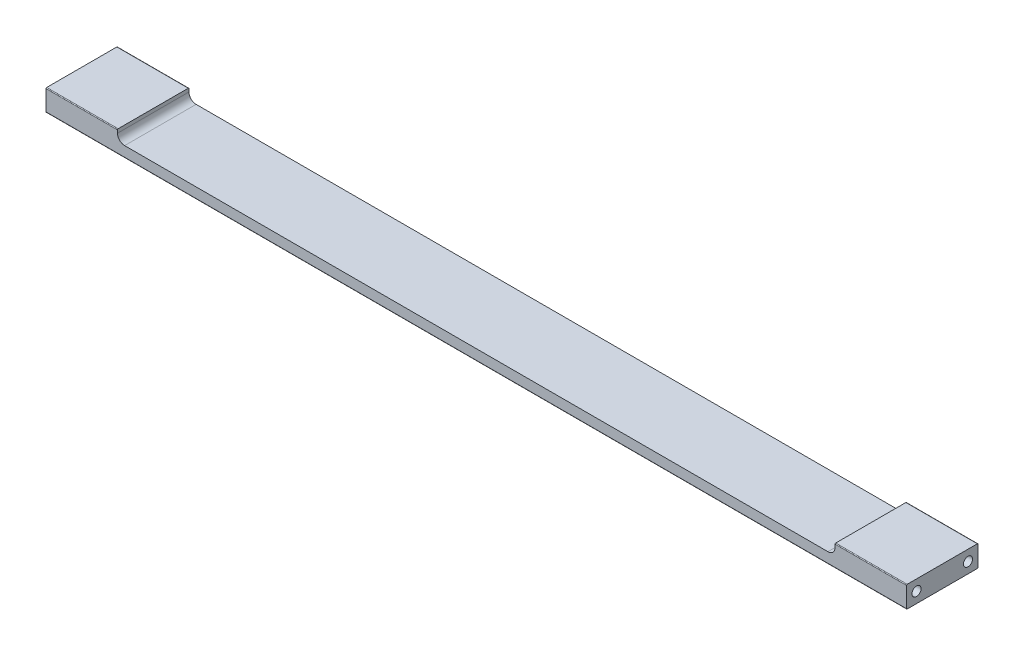
ISO-10303-21;
HEADER;
FILE_DESCRIPTION(('STEP AP214'),'2;1');
FILE_NAME('part.step','',(''),(''),'','','');
FILE_SCHEMA(('AUTOMOTIVE_DESIGN { 1 0 10303 214 1 1 1 1 }'));
ENDSEC;
DATA;
#1=APPLICATION_CONTEXT('core data for automotive mechanical design processes');
#2=APPLICATION_PROTOCOL_DEFINITION('international standard','automotive_design',2000,#1);
#3=PRODUCT_CONTEXT('',#1,'mechanical');
#4=PRODUCT('Part','Part','',(#3));
#5=PRODUCT_RELATED_PRODUCT_CATEGORY('part','',(#4));
#6=PRODUCT_DEFINITION_FORMATION('','',#4);
#7=PRODUCT_DEFINITION_CONTEXT('part definition',#1,'design');
#8=PRODUCT_DEFINITION('design','',#6,#7);
#9=PRODUCT_DEFINITION_SHAPE('','',#8);
#10=(LENGTH_UNIT() NAMED_UNIT(*) SI_UNIT(.MILLI.,.METRE.));
#11=(NAMED_UNIT(*) PLANE_ANGLE_UNIT() SI_UNIT($,.RADIAN.));
#12=(NAMED_UNIT(*) SI_UNIT($,.STERADIAN.) SOLID_ANGLE_UNIT());
#13=UNCERTAINTY_MEASURE_WITH_UNIT(LENGTH_MEASURE(1.E-05),#10,'distance_accuracy_value','');
#14=(GEOMETRIC_REPRESENTATION_CONTEXT(3) GLOBAL_UNCERTAINTY_ASSIGNED_CONTEXT((#13)) GLOBAL_UNIT_ASSIGNED_CONTEXT((#10,
#11,#12)) REPRESENTATION_CONTEXT('',''));
#15=CARTESIAN_POINT('',(0.,0.,0.));
#16=DIRECTION('',(0.,0.,1.));
#17=DIRECTION('',(1.,0.,0.));
#18=AXIS2_PLACEMENT_3D('',#15,#16,#17);
#19=CARTESIAN_POINT('',(0.,4.7625,0.));
#20=DIRECTION('',(0.,1.,0.));
#21=DIRECTION('',(0.,0.,1.));
#22=AXIS2_PLACEMENT_3D('',#19,#20,#21);
#23=PLANE('',#22);
#24=DIRECTION('',(0.,0.,-1.));
#25=VECTOR('',#24,1.);
#26=CARTESIAN_POINT('',(-159.385,4.76249999999999,15.875));
#27=LINE('',#26,#25);
#28=CARTESIAN_POINT('',(-159.385,4.76249999999999,15.560675));
#29=VERTEX_POINT('',#28);
#30=CARTESIAN_POINT('',(-159.385,4.76249999999999,-15.560675));
#31=VERTEX_POINT('',#30);
#32=EDGE_CURVE('E205',#29,#31,#27,.T.);
#33=ORIENTED_EDGE('',*,*,#32,.T.);
#34=DIRECTION('',(-1.,0.,0.));
#35=VECTOR('',#34,1.);
#36=CARTESIAN_POINT('',(0.,4.7625,-15.560675));
#37=LINE('',#36,#35);
#38=CARTESIAN_POINT('',(-191.135,4.7625,-15.560675));
#39=VERTEX_POINT('',#38);
#40=EDGE_CURVE('E299',#31,#39,#37,.T.);
#41=ORIENTED_EDGE('',*,*,#40,.T.);
#42=DIRECTION('',(0.,0.,1.));
#43=VECTOR('',#42,1.);
#44=CARTESIAN_POINT('',(-191.135,4.7625,-15.875));
#45=LINE('',#44,#43);
#46=CARTESIAN_POINT('',(-191.135,4.7625,15.560675));
#47=VERTEX_POINT('',#46);
#48=EDGE_CURVE('E242',#39,#47,#45,.T.);
#49=ORIENTED_EDGE('',*,*,#48,.T.);
#50=DIRECTION('',(1.,0.,0.));
#51=VECTOR('',#50,1.);
#52=CARTESIAN_POINT('',(0.,4.7625,15.560675));
#53=LINE('',#52,#51);
#54=EDGE_CURVE('E296',#47,#29,#53,.T.);
#55=ORIENTED_EDGE('',*,*,#54,.T.);
#56=EDGE_LOOP('',(#33,#41,#49,#55));
#57=FACE_BOUND('',#56,.T.);
#58=ADVANCED_FACE('F37',(#57),#23,.T.);
#59=CARTESIAN_POINT('',(0.,4.448175,-15.560675));
#60=DIRECTION('',(-1.,0.,0.));
#61=DIRECTION('',(0.,0.,1.));
#62=AXIS2_PLACEMENT_3D('',#59,#60,#61);
#63=CYLINDRICAL_SURFACE('',#62,0.314325);
#64=CARTESIAN_POINT('',(-159.385,4.448175,-15.560675));
#65=DIRECTION('',(-1.,0.,0.));
#66=DIRECTION('',(0.,0.,1.));
#67=AXIS2_PLACEMENT_3D('',#64,#65,#66);
#68=CIRCLE('',#67,0.314325);
#69=CARTESIAN_POINT('',(-159.385,4.448175,-15.875));
#70=VERTEX_POINT('',#69);
#71=EDGE_CURVE('E216',#70,#31,#68,.F.);
#72=ORIENTED_EDGE('',*,*,#71,.F.);
#73=DIRECTION('',(-1.,0.,0.));
#74=VECTOR('',#73,1.);
#75=CARTESIAN_POINT('',(-191.135,4.448175,-15.875));
#76=LINE('',#75,#74);
#77=CARTESIAN_POINT('',(-191.135,4.448175,-15.875));
#78=VERTEX_POINT('',#77);
#79=EDGE_CURVE('E289',#78,#70,#76,.F.);
#80=ORIENTED_EDGE('',*,*,#79,.F.);
#81=CARTESIAN_POINT('',(-191.135,4.448175,-15.560675));
#82=DIRECTION('',(-1.,0.,0.));
#83=DIRECTION('',(0.,0.,1.));
#84=AXIS2_PLACEMENT_3D('',#81,#82,#83);
#85=CIRCLE('',#84,0.314325);
#86=EDGE_CURVE('E60',#39,#78,#85,.T.);
#87=ORIENTED_EDGE('',*,*,#86,.F.);
#88=ORIENTED_EDGE('',*,*,#40,.F.);
#89=EDGE_LOOP('',(#72,#80,#87,#88));
#90=FACE_BOUND('',#89,.T.);
#91=ADVANCED_FACE('F359',(#90),#63,.T.);
#92=CARTESIAN_POINT('',(0.,4.448175,15.560675));
#93=DIRECTION('',(1.,0.,0.));
#94=DIRECTION('',(0.,0.,-1.));
#95=AXIS2_PLACEMENT_3D('',#92,#93,#94);
#96=CYLINDRICAL_SURFACE('',#95,0.314325);
#97=CARTESIAN_POINT('',(-159.385,4.448175,15.560675));
#98=DIRECTION('',(-1.,0.,0.));
#99=DIRECTION('',(0.,0.,1.));
#100=AXIS2_PLACEMENT_3D('',#97,#98,#99);
#101=CIRCLE('',#100,0.314325);
#102=CARTESIAN_POINT('',(-159.385,4.448175,15.875));
#103=VERTEX_POINT('',#102);
#104=EDGE_CURVE('E11',#29,#103,#101,.F.);
#105=ORIENTED_EDGE('',*,*,#104,.F.);
#106=ORIENTED_EDGE('',*,*,#54,.F.);
#107=CARTESIAN_POINT('',(-191.135,4.448175,15.560675));
#108=DIRECTION('',(-1.,0.,0.));
#109=DIRECTION('',(0.,0.,1.));
#110=AXIS2_PLACEMENT_3D('',#107,#108,#109);
#111=CIRCLE('',#110,0.314325);
#112=CARTESIAN_POINT('',(-191.135,4.448175,15.875));
#113=VERTEX_POINT('',#112);
#114=EDGE_CURVE('E281',#113,#47,#111,.T.);
#115=ORIENTED_EDGE('',*,*,#114,.F.);
#116=DIRECTION('',(1.,0.,0.));
#117=VECTOR('',#116,1.);
#118=CARTESIAN_POINT('',(-191.135,4.448175,15.875));
#119=LINE('',#118,#117);
#120=EDGE_CURVE('E257',#103,#113,#119,.F.);
#121=ORIENTED_EDGE('',*,*,#120,.F.);
#122=EDGE_LOOP('',(#105,#106,#115,#121));
#123=FACE_BOUND('',#122,.T.);
#124=ADVANCED_FACE('F336',(#123),#96,.T.);
#125=CARTESIAN_POINT('',(-191.135,-4.7625,-15.875));
#126=DIRECTION('',(-1.,0.,0.));
#127=DIRECTION('',(0.,0.,1.));
#128=AXIS2_PLACEMENT_3D('',#125,#126,#127);
#129=PLANE('',#128);
#130=CARTESIAN_POINT('',(-191.135,0.,-11.43));
#131=DIRECTION('',(-1.,0.,0.));
#132=DIRECTION('',(0.,0.,1.));
#133=AXIS2_PLACEMENT_3D('',#130,#131,#132);
#134=CIRCLE('',#133,2.01929999999999);
#135=CARTESIAN_POINT('',(-191.135,0.,-9.41070000000001));
#136=VERTEX_POINT('',#135);
#137=EDGE_CURVE('E230',#136,#136,#134,.T.);
#138=ORIENTED_EDGE('',*,*,#137,.F.);
#139=EDGE_LOOP('',(#138));
#140=FACE_BOUND('',#139,.T.);
#141=CARTESIAN_POINT('',(-191.135,0.,11.43));
#142=DIRECTION('',(-1.,0.,0.));
#143=DIRECTION('',(0.,0.,1.));
#144=AXIS2_PLACEMENT_3D('',#141,#142,#143);
#145=CIRCLE('',#144,2.01929999999999);
#146=CARTESIAN_POINT('',(-191.135,0.,13.4493));
#147=VERTEX_POINT('',#146);
#148=EDGE_CURVE('E236',#147,#147,#145,.T.);
#149=ORIENTED_EDGE('',*,*,#148,.F.);
#150=EDGE_LOOP('',(#149));
#151=FACE_BOUND('',#150,.T.);
#152=DIRECTION('',(0.,0.,1.));
#153=VECTOR('',#152,1.);
#154=CARTESIAN_POINT('',(-191.135,-4.7625,-15.875));
#155=LINE('',#154,#153);
#156=CARTESIAN_POINT('',(-191.135,-4.7625,-15.560675));
#157=VERTEX_POINT('',#156);
#158=CARTESIAN_POINT('',(-191.135,-4.7625,15.560675));
#159=VERTEX_POINT('',#158);
#160=EDGE_CURVE('E248',#157,#159,#155,.T.);
#161=ORIENTED_EDGE('',*,*,#160,.T.);
#162=CARTESIAN_POINT('',(-191.135,-4.448175,15.560675));
#163=DIRECTION('',(-1.,0.,0.));
#164=DIRECTION('',(0.,0.,1.));
#165=AXIS2_PLACEMENT_3D('',#162,#163,#164);
#166=CIRCLE('',#165,0.314325);
#167=CARTESIAN_POINT('',(-191.135,-4.448175,15.875));
#168=VERTEX_POINT('',#167);
#169=EDGE_CURVE('E286',#159,#168,#166,.T.);
#170=ORIENTED_EDGE('',*,*,#169,.T.);
#171=DIRECTION('',(0.,1.,0.));
#172=VECTOR('',#171,1.);
#173=CARTESIAN_POINT('',(-191.135,-4.7625,15.875));
#174=LINE('',#173,#172);
#175=EDGE_CURVE('E254',#168,#113,#174,.T.);
#176=ORIENTED_EDGE('',*,*,#175,.T.);
#177=ORIENTED_EDGE('',*,*,#114,.T.);
#178=ORIENTED_EDGE('',*,*,#48,.F.);
#179=ORIENTED_EDGE('',*,*,#86,.T.);
#180=DIRECTION('',(0.,1.,0.));
#181=VECTOR('',#180,1.);
#182=CARTESIAN_POINT('',(-191.135,-4.7625,-15.875));
#183=LINE('',#182,#181);
#184=CARTESIAN_POINT('',(-191.135,-4.448175,-15.875));
#185=VERTEX_POINT('',#184);
#186=EDGE_CURVE('E255',#185,#78,#183,.T.);
#187=ORIENTED_EDGE('',*,*,#186,.F.);
#188=CARTESIAN_POINT('',(-191.135,-4.448175,-15.560675));
#189=DIRECTION('',(-1.,0.,0.));
#190=DIRECTION('',(0.,0.,1.));
#191=AXIS2_PLACEMENT_3D('',#188,#189,#190);
#192=CIRCLE('',#191,0.314325);
#193=EDGE_CURVE('E284',#185,#157,#192,.T.);
#194=ORIENTED_EDGE('',*,*,#193,.T.);
#195=EDGE_LOOP('',(#161,#170,#176,#177,#178,#179,#187,#194));
#196=FACE_BOUND('',#195,.T.);
#197=ADVANCED_FACE('F340',(#140,#151,#196),#129,.T.);
#198=CARTESIAN_POINT('',(-191.135,-4.7625,-15.875));
#199=DIRECTION('',(0.,0.,-1.));
#200=DIRECTION('',(-1.,0.,0.));
#201=AXIS2_PLACEMENT_3D('',#198,#199,#200);
#202=PLANE('',#201);
#203=DIRECTION('',(0.,1.,0.));
#204=VECTOR('',#203,1.);
#205=CARTESIAN_POINT('',(-159.385,4.76249999999999,-15.875));
#206=LINE('',#205,#204);
#207=CARTESIAN_POINT('',(-159.385,3.17500000000004,-15.875));
#208=VERTEX_POINT('',#207);
#209=EDGE_CURVE('E186',#208,#70,#206,.T.);
#210=ORIENTED_EDGE('',*,*,#209,.F.);
#211=CARTESIAN_POINT('',(-156.21,3.175,-15.875));
#212=DIRECTION('',(0.,0.,-1.));
#213=DIRECTION('',(1.,0.,0.));
#214=AXIS2_PLACEMENT_3D('',#211,#212,#213);
#215=CIRCLE('',#214,3.17499999999999);
#216=CARTESIAN_POINT('',(-156.21,0.,-15.875));
#217=VERTEX_POINT('',#216);
#218=EDGE_CURVE('E188',#217,#208,#215,.T.);
#219=ORIENTED_EDGE('',*,*,#218,.F.);
#220=DIRECTION('',(-1.,0.,0.));
#221=VECTOR('',#220,1.);
#222=CARTESIAN_POINT('',(-156.21,0.,-15.875));
#223=LINE('',#222,#221);
#224=CARTESIAN_POINT('',(156.21,0.,-15.875));
#225=VERTEX_POINT('',#224);
#226=EDGE_CURVE('E200',#225,#217,#223,.T.);
#227=ORIENTED_EDGE('',*,*,#226,.F.);
#228=CARTESIAN_POINT('',(156.21,3.17499999999996,-15.875));
#229=DIRECTION('',(0.,0.,-1.));
#230=DIRECTION('',(1.,0.,0.));
#231=AXIS2_PLACEMENT_3D('',#228,#229,#230);
#232=CIRCLE('',#231,3.17500000000001);
#233=CARTESIAN_POINT('',(159.385,3.17499999999996,-15.875));
#234=VERTEX_POINT('',#233);
#235=EDGE_CURVE('E198',#234,#225,#232,.T.);
#236=ORIENTED_EDGE('',*,*,#235,.F.);
#237=DIRECTION('',(0.,-1.,0.));
#238=VECTOR('',#237,1.);
#239=CARTESIAN_POINT('',(159.385,3.17499999999998,-15.875));
#240=LINE('',#239,#238);
#241=CARTESIAN_POINT('',(159.385,4.448175,-15.875));
#242=VERTEX_POINT('',#241);
#243=EDGE_CURVE('E165',#242,#234,#240,.T.);
#244=ORIENTED_EDGE('',*,*,#243,.F.);
#245=CARTESIAN_POINT('',(191.135,4.448175,-15.875));
#246=VERTEX_POINT('',#245);
#247=EDGE_CURVE('E288',#242,#246,#76,.F.);
#248=ORIENTED_EDGE('',*,*,#247,.T.);
#249=DIRECTION('',(0.,1.,0.));
#250=VECTOR('',#249,1.);
#251=CARTESIAN_POINT('',(191.135,-4.7625,-15.875));
#252=LINE('',#251,#250);
#253=CARTESIAN_POINT('',(191.135,-4.448175,-15.875));
#254=VERTEX_POINT('',#253);
#255=EDGE_CURVE('E258',#254,#246,#252,.T.);
#256=ORIENTED_EDGE('',*,*,#255,.F.);
#257=DIRECTION('',(-1.,0.,0.));
#258=VECTOR('',#257,1.);
#259=CARTESIAN_POINT('',(-191.135,-4.448175,-15.875));
#260=LINE('',#259,#258);
#261=EDGE_CURVE('E292',#254,#185,#260,.T.);
#262=ORIENTED_EDGE('',*,*,#261,.T.);
#263=ORIENTED_EDGE('',*,*,#186,.T.);
#264=ORIENTED_EDGE('',*,*,#79,.T.);
#265=EDGE_LOOP('',(#210,#219,#227,#236,#244,#248,#256,#262,#263,#264));
#266=FACE_BOUND('',#265,.T.);
#267=ADVANCED_FACE('F320',(#266),#202,.T.);
#268=CARTESIAN_POINT('',(191.135,-4.7625,-15.875));
#269=DIRECTION('',(1.,0.,0.));
#270=DIRECTION('',(0.,0.,-1.));
#271=AXIS2_PLACEMENT_3D('',#268,#269,#270);
#272=PLANE('',#271);
#273=CARTESIAN_POINT('',(191.135,0.,11.43));
#274=DIRECTION('',(1.,0.,0.));
#275=DIRECTION('',(0.,0.,-1.));
#276=AXIS2_PLACEMENT_3D('',#273,#274,#275);
#277=CIRCLE('',#276,2.01929999999999);
#278=CARTESIAN_POINT('',(191.135,0.,9.41070000000001));
#279=VERTEX_POINT('',#278);
#280=EDGE_CURVE('E218',#279,#279,#277,.T.);
#281=ORIENTED_EDGE('',*,*,#280,.F.);
#282=EDGE_LOOP('',(#281));
#283=FACE_BOUND('',#282,.T.);
#284=CARTESIAN_POINT('',(191.135,0.,-11.43));
#285=DIRECTION('',(1.,0.,0.));
#286=DIRECTION('',(0.,0.,-1.));
#287=AXIS2_PLACEMENT_3D('',#284,#285,#286);
#288=CIRCLE('',#287,2.01929999999999);
#289=CARTESIAN_POINT('',(191.135,0.,-13.4493));
#290=VERTEX_POINT('',#289);
#291=EDGE_CURVE('E224',#290,#290,#288,.T.);
#292=ORIENTED_EDGE('',*,*,#291,.F.);
#293=EDGE_LOOP('',(#292));
#294=FACE_BOUND('',#293,.T.);
#295=DIRECTION('',(0.,1.,0.));
#296=VECTOR('',#295,1.);
#297=CARTESIAN_POINT('',(191.135,-4.7625,15.875));
#298=LINE('',#297,#296);
#299=CARTESIAN_POINT('',(191.135,-4.448175,15.875));
#300=VERTEX_POINT('',#299);
#301=CARTESIAN_POINT('',(191.135,4.448175,15.875));
#302=VERTEX_POINT('',#301);
#303=EDGE_CURVE('E261',#300,#302,#298,.T.);
#304=ORIENTED_EDGE('',*,*,#303,.F.);
#305=CARTESIAN_POINT('',(191.135,-4.448175,15.560675));
#306=DIRECTION('',(1.,0.,0.));
#307=DIRECTION('',(0.,0.,-1.));
#308=AXIS2_PLACEMENT_3D('',#305,#306,#307);
#309=CIRCLE('',#308,0.314325);
#310=CARTESIAN_POINT('',(191.135,-4.7625,15.560675));
#311=VERTEX_POINT('',#310);
#312=EDGE_CURVE('E275',#300,#311,#309,.T.);
#313=ORIENTED_EDGE('',*,*,#312,.T.);
#314=DIRECTION('',(0.,0.,-1.));
#315=VECTOR('',#314,1.);
#316=CARTESIAN_POINT('',(191.135,-4.7625,-15.875));
#317=LINE('',#316,#315);
#318=CARTESIAN_POINT('',(191.135,-4.7625,-15.560675));
#319=VERTEX_POINT('',#318);
#320=EDGE_CURVE('E251',#311,#319,#317,.T.);
#321=ORIENTED_EDGE('',*,*,#320,.T.);
#322=CARTESIAN_POINT('',(191.135,-4.448175,-15.560675));
#323=DIRECTION('',(1.,0.,0.));
#324=DIRECTION('',(0.,0.,-1.));
#325=AXIS2_PLACEMENT_3D('',#322,#323,#324);
#326=CIRCLE('',#325,0.314325);
#327=EDGE_CURVE('E273',#319,#254,#326,.T.);
#328=ORIENTED_EDGE('',*,*,#327,.T.);
#329=ORIENTED_EDGE('',*,*,#255,.T.);
#330=CARTESIAN_POINT('',(191.135,4.448175,-15.560675));
#331=DIRECTION('',(1.,0.,0.));
#332=DIRECTION('',(0.,0.,-1.));
#333=AXIS2_PLACEMENT_3D('',#330,#331,#332);
#334=CIRCLE('',#333,0.314325);
#335=CARTESIAN_POINT('',(191.135,4.7625,-15.560675));
#336=VERTEX_POINT('',#335);
#337=EDGE_CURVE('E271',#246,#336,#334,.T.);
#338=ORIENTED_EDGE('',*,*,#337,.T.);
#339=DIRECTION('',(0.,0.,-1.));
#340=VECTOR('',#339,1.);
#341=CARTESIAN_POINT('',(191.135,4.7625,-15.875));
#342=LINE('',#341,#340);
#343=CARTESIAN_POINT('',(191.135,4.7625,15.560675));
#344=VERTEX_POINT('',#343);
#345=EDGE_CURVE('E245',#344,#336,#342,.T.);
#346=ORIENTED_EDGE('',*,*,#345,.F.);
#347=CARTESIAN_POINT('',(191.135,4.448175,15.560675));
#348=DIRECTION('',(1.,0.,0.));
#349=DIRECTION('',(0.,0.,-1.));
#350=AXIS2_PLACEMENT_3D('',#347,#348,#349);
#351=CIRCLE('',#350,0.314325);
#352=EDGE_CURVE('E269',#344,#302,#351,.T.);
#353=ORIENTED_EDGE('',*,*,#352,.T.);
#354=EDGE_LOOP('',(#304,#313,#321,#328,#329,#338,#346,#353));
#355=FACE_BOUND('',#354,.T.);
#356=ADVANCED_FACE('F313',(#283,#294,#355),#272,.T.);
#357=CARTESIAN_POINT('',(-191.135,-4.7625,15.875));
#358=DIRECTION('',(0.,0.,1.));
#359=DIRECTION('',(1.,0.,0.));
#360=AXIS2_PLACEMENT_3D('',#357,#358,#359);
#361=PLANE('',#360);
#362=DIRECTION('',(0.,1.,0.));
#363=VECTOR('',#362,1.);
#364=CARTESIAN_POINT('',(-159.385,4.76249999999999,15.875));
#365=LINE('',#364,#363);
#366=CARTESIAN_POINT('',(-159.385,3.17500000000004,15.875));
#367=VERTEX_POINT('',#366);
#368=EDGE_CURVE('E195',#367,#103,#365,.T.);
#369=ORIENTED_EDGE('',*,*,#368,.T.);
#370=ORIENTED_EDGE('',*,*,#120,.T.);
#371=ORIENTED_EDGE('',*,*,#175,.F.);
#372=DIRECTION('',(1.,0.,0.));
#373=VECTOR('',#372,1.);
#374=CARTESIAN_POINT('',(191.135,-4.448175,15.875));
#375=LINE('',#374,#373);
#376=EDGE_CURVE('E266',#168,#300,#375,.T.);
#377=ORIENTED_EDGE('',*,*,#376,.T.);
#378=ORIENTED_EDGE('',*,*,#303,.T.);
#379=CARTESIAN_POINT('',(159.385,4.448175,15.875));
#380=VERTEX_POINT('',#379);
#381=EDGE_CURVE('E185',#302,#380,#119,.F.);
#382=ORIENTED_EDGE('',*,*,#381,.T.);
#383=DIRECTION('',(0.,-1.,0.));
#384=VECTOR('',#383,1.);
#385=CARTESIAN_POINT('',(159.385,3.17499999999998,15.875));
#386=LINE('',#385,#384);
#387=CARTESIAN_POINT('',(159.385,3.17499999999996,15.875));
#388=VERTEX_POINT('',#387);
#389=EDGE_CURVE('E52',#380,#388,#386,.T.);
#390=ORIENTED_EDGE('',*,*,#389,.T.);
#391=CARTESIAN_POINT('',(156.21,3.17499999999996,15.875));
#392=DIRECTION('',(0.,0.,-1.));
#393=DIRECTION('',(1.,0.,0.));
#394=AXIS2_PLACEMENT_3D('',#391,#392,#393);
#395=CIRCLE('',#394,3.17500000000001);
#396=CARTESIAN_POINT('',(156.21,0.,15.875));
#397=VERTEX_POINT('',#396);
#398=EDGE_CURVE('E173',#388,#397,#395,.T.);
#399=ORIENTED_EDGE('',*,*,#398,.T.);
#400=DIRECTION('',(-1.,0.,0.));
#401=VECTOR('',#400,1.);
#402=CARTESIAN_POINT('',(-156.21,0.,15.875));
#403=LINE('',#402,#401);
#404=CARTESIAN_POINT('',(-156.21,0.,15.875));
#405=VERTEX_POINT('',#404);
#406=EDGE_CURVE('E178',#397,#405,#403,.T.);
#407=ORIENTED_EDGE('',*,*,#406,.T.);
#408=CARTESIAN_POINT('',(-156.21,3.175,15.875));
#409=DIRECTION('',(0.,0.,-1.));
#410=DIRECTION('',(1.,0.,0.));
#411=AXIS2_PLACEMENT_3D('',#408,#409,#410);
#412=CIRCLE('',#411,3.17499999999999);
#413=EDGE_CURVE('E192',#405,#367,#412,.T.);
#414=ORIENTED_EDGE('',*,*,#413,.T.);
#415=EDGE_LOOP('',(#369,#370,#371,#377,#378,#382,#390,#399,#407,#414));
#416=FACE_BOUND('',#415,.T.);
#417=ADVANCED_FACE('F182',(#416),#361,.T.);
#418=CARTESIAN_POINT('',(0.,-4.7625,0.));
#419=DIRECTION('',(0.,1.,0.));
#420=DIRECTION('',(0.,0.,1.));
#421=AXIS2_PLACEMENT_3D('',#418,#419,#420);
#422=PLANE('',#421);
#423=ORIENTED_EDGE('',*,*,#320,.F.);
#424=DIRECTION('',(1.,0.,0.));
#425=VECTOR('',#424,1.);
#426=CARTESIAN_POINT('',(-191.135,-4.7625,15.560675));
#427=LINE('',#426,#425);
#428=EDGE_CURVE('E279',#311,#159,#427,.F.);
#429=ORIENTED_EDGE('',*,*,#428,.T.);
#430=ORIENTED_EDGE('',*,*,#160,.F.);
#431=DIRECTION('',(-1.,0.,0.));
#432=VECTOR('',#431,1.);
#433=CARTESIAN_POINT('',(191.135,-4.7625,-15.560675));
#434=LINE('',#433,#432);
#435=EDGE_CURVE('E277',#157,#319,#434,.F.);
#436=ORIENTED_EDGE('',*,*,#435,.T.);
#437=EDGE_LOOP('',(#423,#429,#430,#436));
#438=FACE_BOUND('',#437,.T.);
#439=ADVANCED_FACE('F350',(#438),#422,.F.);
#440=DIRECTION('',(0.,0.,-1.));
#441=VECTOR('',#440,1.);
#442=CARTESIAN_POINT('',(159.385,4.76249999999999,15.875));
#443=LINE('',#442,#441);
#444=CARTESIAN_POINT('',(159.385,4.76249999999999,15.560675));
#445=VERTEX_POINT('',#444);
#446=CARTESIAN_POINT('',(159.385,4.76249999999999,-15.560675));
#447=VERTEX_POINT('',#446);
#448=EDGE_CURVE('E170',#445,#447,#443,.T.);
#449=ORIENTED_EDGE('',*,*,#448,.F.);
#450=EDGE_CURVE('E295',#445,#344,#53,.T.);
#451=ORIENTED_EDGE('',*,*,#450,.T.);
#452=ORIENTED_EDGE('',*,*,#345,.T.);
#453=EDGE_CURVE('E300',#336,#447,#37,.T.);
#454=ORIENTED_EDGE('',*,*,#453,.T.);
#455=EDGE_LOOP('',(#449,#451,#452,#454));
#456=FACE_BOUND('',#455,.T.);
#457=ADVANCED_FACE('F307',(#456),#23,.T.);
#458=CARTESIAN_POINT('',(-191.135,-4.448175,15.560675));
#459=DIRECTION('',(-1.,0.,0.));
#460=DIRECTION('',(0.,0.,1.));
#461=AXIS2_PLACEMENT_3D('',#458,#459,#460);
#462=CYLINDRICAL_SURFACE('',#461,0.314325);
#463=ORIENTED_EDGE('',*,*,#169,.F.);
#464=ORIENTED_EDGE('',*,*,#428,.F.);
#465=ORIENTED_EDGE('',*,*,#312,.F.);
#466=ORIENTED_EDGE('',*,*,#376,.F.);
#467=EDGE_LOOP('',(#463,#464,#465,#466));
#468=FACE_BOUND('',#467,.T.);
#469=ADVANCED_FACE('F345',(#468),#462,.T.);
#470=CARTESIAN_POINT('',(-191.135,-4.448175,-15.560675));
#471=DIRECTION('',(1.,0.,0.));
#472=DIRECTION('',(0.,0.,-1.));
#473=AXIS2_PLACEMENT_3D('',#470,#471,#472);
#474=CYLINDRICAL_SURFACE('',#473,0.314325);
#475=ORIENTED_EDGE('',*,*,#327,.F.);
#476=ORIENTED_EDGE('',*,*,#435,.F.);
#477=ORIENTED_EDGE('',*,*,#193,.F.);
#478=ORIENTED_EDGE('',*,*,#261,.F.);
#479=EDGE_LOOP('',(#475,#476,#477,#478));
#480=FACE_BOUND('',#479,.T.);
#481=ADVANCED_FACE('F354',(#480),#474,.T.);
#482=CARTESIAN_POINT('',(159.385,4.448175,-15.560675));
#483=DIRECTION('',(1.,0.,0.));
#484=DIRECTION('',(0.,0.,-1.));
#485=AXIS2_PLACEMENT_3D('',#482,#483,#484);
#486=CIRCLE('',#485,0.314325);
#487=EDGE_CURVE('E208',#447,#242,#486,.F.);
#488=ORIENTED_EDGE('',*,*,#487,.F.);
#489=ORIENTED_EDGE('',*,*,#453,.F.);
#490=ORIENTED_EDGE('',*,*,#337,.F.);
#491=ORIENTED_EDGE('',*,*,#247,.F.);
#492=EDGE_LOOP('',(#488,#489,#490,#491));
#493=FACE_BOUND('',#492,.T.);
#494=ADVANCED_FACE('F316',(#493),#63,.T.);
#495=CARTESIAN_POINT('',(159.385,4.448175,15.560675));
#496=DIRECTION('',(1.,0.,0.));
#497=DIRECTION('',(0.,0.,-1.));
#498=AXIS2_PLACEMENT_3D('',#495,#496,#497);
#499=CIRCLE('',#498,0.314325);
#500=EDGE_CURVE('E45',#380,#445,#499,.F.);
#501=ORIENTED_EDGE('',*,*,#500,.F.);
#502=ORIENTED_EDGE('',*,*,#381,.F.);
#503=ORIENTED_EDGE('',*,*,#352,.F.);
#504=ORIENTED_EDGE('',*,*,#450,.F.);
#505=EDGE_LOOP('',(#501,#502,#503,#504));
#506=FACE_BOUND('',#505,.T.);
#507=ADVANCED_FACE('F39',(#506),#96,.T.);
#508=CARTESIAN_POINT('',(-165.735,0.,11.43));
#509=DIRECTION('',(-1.,0.,0.));
#510=DIRECTION('',(0.,0.,1.));
#511=AXIS2_PLACEMENT_3D('',#508,#509,#510);
#512=CONICAL_SURFACE('',#511,2.01929999999999,1.02974425867665);
#513=CARTESIAN_POINT('',(-164.521682151998,0.,11.43));
#514=VERTEX_POINT('',#513);
#515=VERTEX_LOOP('',#514);
#516=FACE_BOUND('',#515,.T.);
#517=CARTESIAN_POINT('',(-165.735,0.,11.43));
#518=DIRECTION('',(-1.,0.,0.));
#519=DIRECTION('',(0.,0.,1.));
#520=AXIS2_PLACEMENT_3D('',#517,#518,#519);
#521=CIRCLE('',#520,2.01929999999999);
#522=CARTESIAN_POINT('',(-165.735,0.,13.4493));
#523=VERTEX_POINT('',#522);
#524=EDGE_CURVE('E239',#523,#523,#521,.T.);
#525=ORIENTED_EDGE('',*,*,#524,.T.);
#526=EDGE_LOOP('',(#525));
#527=FACE_BOUND('',#526,.T.);
#528=ADVANCED_FACE('F372',(#516,#527),#512,.F.);
#529=CARTESIAN_POINT('',(-191.135,0.,11.43));
#530=DIRECTION('',(-1.,0.,0.));
#531=DIRECTION('',(0.,0.,1.));
#532=AXIS2_PLACEMENT_3D('',#529,#530,#531);
#533=CYLINDRICAL_SURFACE('',#532,2.01929999999999);
#534=ORIENTED_EDGE('',*,*,#524,.F.);
#535=EDGE_LOOP('',(#534));
#536=FACE_BOUND('',#535,.T.);
#537=ORIENTED_EDGE('',*,*,#148,.T.);
#538=EDGE_LOOP('',(#537));
#539=FACE_BOUND('',#538,.T.);
#540=ADVANCED_FACE('F393',(#536,#539),#533,.F.);
#541=CARTESIAN_POINT('',(-165.735,0.,-11.43));
#542=DIRECTION('',(-1.,0.,0.));
#543=DIRECTION('',(0.,0.,1.));
#544=AXIS2_PLACEMENT_3D('',#541,#542,#543);
#545=CONICAL_SURFACE('',#544,2.01929999999999,1.02974425867665);
#546=CARTESIAN_POINT('',(-164.521682151998,0.,-11.43));
#547=VERTEX_POINT('',#546);
#548=VERTEX_LOOP('',#547);
#549=FACE_BOUND('',#548,.T.);
#550=CARTESIAN_POINT('',(-165.735,0.,-11.43));
#551=DIRECTION('',(-1.,0.,0.));
#552=DIRECTION('',(0.,0.,1.));
#553=AXIS2_PLACEMENT_3D('',#550,#551,#552);
#554=CIRCLE('',#553,2.01929999999999);
#555=CARTESIAN_POINT('',(-165.735,0.,-9.41070000000001));
#556=VERTEX_POINT('',#555);
#557=EDGE_CURVE('E233',#556,#556,#554,.T.);
#558=ORIENTED_EDGE('',*,*,#557,.T.);
#559=EDGE_LOOP('',(#558));
#560=FACE_BOUND('',#559,.T.);
#561=ADVANCED_FACE('F397',(#549,#560),#545,.F.);
#562=CARTESIAN_POINT('',(-191.135,0.,-11.43));
#563=DIRECTION('',(-1.,0.,0.));
#564=DIRECTION('',(0.,0.,1.));
#565=AXIS2_PLACEMENT_3D('',#562,#563,#564);
#566=CYLINDRICAL_SURFACE('',#565,2.01929999999999);
#567=ORIENTED_EDGE('',*,*,#557,.F.);
#568=EDGE_LOOP('',(#567));
#569=FACE_BOUND('',#568,.T.);
#570=ORIENTED_EDGE('',*,*,#137,.T.);
#571=EDGE_LOOP('',(#570));
#572=FACE_BOUND('',#571,.T.);
#573=ADVANCED_FACE('F401',(#569,#572),#566,.F.);
#574=CARTESIAN_POINT('',(165.735,0.,-11.43));
#575=DIRECTION('',(1.,0.,0.));
#576=DIRECTION('',(0.,0.,-1.));
#577=AXIS2_PLACEMENT_3D('',#574,#575,#576);
#578=CONICAL_SURFACE('',#577,2.01929999999999,1.02974425867665);
#579=CARTESIAN_POINT('',(164.521682151998,0.,-11.43));
#580=VERTEX_POINT('',#579);
#581=VERTEX_LOOP('',#580);
#582=FACE_BOUND('',#581,.T.);
#583=CARTESIAN_POINT('',(165.735,0.,-11.43));
#584=DIRECTION('',(1.,0.,0.));
#585=DIRECTION('',(0.,0.,-1.));
#586=AXIS2_PLACEMENT_3D('',#583,#584,#585);
#587=CIRCLE('',#586,2.01929999999999);
#588=CARTESIAN_POINT('',(165.735,0.,-13.4493));
#589=VERTEX_POINT('',#588);
#590=EDGE_CURVE('E227',#589,#589,#587,.T.);
#591=ORIENTED_EDGE('',*,*,#590,.T.);
#592=EDGE_LOOP('',(#591));
#593=FACE_BOUND('',#592,.T.);
#594=ADVANCED_FACE('F405',(#582,#593),#578,.F.);
#595=CARTESIAN_POINT('',(191.135,0.,-11.43));
#596=DIRECTION('',(1.,0.,0.));
#597=DIRECTION('',(0.,0.,-1.));
#598=AXIS2_PLACEMENT_3D('',#595,#596,#597);
#599=CYLINDRICAL_SURFACE('',#598,2.01929999999999);
#600=ORIENTED_EDGE('',*,*,#590,.F.);
#601=EDGE_LOOP('',(#600));
#602=FACE_BOUND('',#601,.T.);
#603=ORIENTED_EDGE('',*,*,#291,.T.);
#604=EDGE_LOOP('',(#603));
#605=FACE_BOUND('',#604,.T.);
#606=ADVANCED_FACE('F409',(#602,#605),#599,.F.);
#607=CARTESIAN_POINT('',(165.735,0.,11.43));
#608=DIRECTION('',(1.,0.,0.));
#609=DIRECTION('',(0.,0.,-1.));
#610=AXIS2_PLACEMENT_3D('',#607,#608,#609);
#611=CONICAL_SURFACE('',#610,2.01929999999999,1.02974425867665);
#612=CARTESIAN_POINT('',(164.521682151998,0.,11.43));
#613=VERTEX_POINT('',#612);
#614=VERTEX_LOOP('',#613);
#615=FACE_BOUND('',#614,.T.);
#616=CARTESIAN_POINT('',(165.735,0.,11.43));
#617=DIRECTION('',(1.,0.,0.));
#618=DIRECTION('',(0.,0.,-1.));
#619=AXIS2_PLACEMENT_3D('',#616,#617,#618);
#620=CIRCLE('',#619,2.01929999999999);
#621=CARTESIAN_POINT('',(165.735,0.,9.41070000000001));
#622=VERTEX_POINT('',#621);
#623=EDGE_CURVE('E221',#622,#622,#620,.T.);
#624=ORIENTED_EDGE('',*,*,#623,.T.);
#625=EDGE_LOOP('',(#624));
#626=FACE_BOUND('',#625,.T.);
#627=ADVANCED_FACE('F413',(#615,#626),#611,.F.);
#628=CARTESIAN_POINT('',(191.135,0.,11.43));
#629=DIRECTION('',(1.,0.,0.));
#630=DIRECTION('',(0.,0.,-1.));
#631=AXIS2_PLACEMENT_3D('',#628,#629,#630);
#632=CYLINDRICAL_SURFACE('',#631,2.01929999999999);
#633=ORIENTED_EDGE('',*,*,#623,.F.);
#634=EDGE_LOOP('',(#633));
#635=FACE_BOUND('',#634,.T.);
#636=ORIENTED_EDGE('',*,*,#280,.T.);
#637=EDGE_LOOP('',(#636));
#638=FACE_BOUND('',#637,.T.);
#639=ADVANCED_FACE('F417',(#635,#638),#632,.F.);
#640=CARTESIAN_POINT('',(-159.385,4.76249999999999,15.875));
#641=DIRECTION('',(-1.,0.,0.));
#642=DIRECTION('',(0.,0.,1.));
#643=AXIS2_PLACEMENT_3D('',#640,#641,#642);
#644=PLANE('',#643);
#645=ORIENTED_EDGE('',*,*,#71,.T.);
#646=ORIENTED_EDGE('',*,*,#32,.F.);
#647=ORIENTED_EDGE('',*,*,#104,.T.);
#648=ORIENTED_EDGE('',*,*,#368,.F.);
#649=DIRECTION('',(0.,0.,-1.));
#650=VECTOR('',#649,1.);
#651=CARTESIAN_POINT('',(-159.385,3.17500000000004,15.875));
#652=LINE('',#651,#650);
#653=EDGE_CURVE('E209',#367,#208,#652,.T.);
#654=ORIENTED_EDGE('',*,*,#653,.T.);
#655=ORIENTED_EDGE('',*,*,#209,.T.);
#656=EDGE_LOOP('',(#645,#646,#647,#648,#654,#655));
#657=FACE_BOUND('',#656,.T.);
#658=ADVANCED_FACE('F332',(#657),#644,.F.);
#659=CARTESIAN_POINT('',(-156.21,3.175,15.875));
#660=DIRECTION('',(0.,0.,-1.));
#661=DIRECTION('',(-1.,0.,0.));
#662=AXIS2_PLACEMENT_3D('',#659,#660,#661);
#663=CYLINDRICAL_SURFACE('',#662,3.17499999999999);
#664=ORIENTED_EDGE('',*,*,#218,.T.);
#665=ORIENTED_EDGE('',*,*,#653,.F.);
#666=ORIENTED_EDGE('',*,*,#413,.F.);
#667=DIRECTION('',(0.,0.,-1.));
#668=VECTOR('',#667,1.);
#669=CARTESIAN_POINT('',(-156.21,0.,15.875));
#670=LINE('',#669,#668);
#671=EDGE_CURVE('E211',#405,#217,#670,.T.);
#672=ORIENTED_EDGE('',*,*,#671,.T.);
#673=EDGE_LOOP('',(#664,#665,#666,#672));
#674=FACE_BOUND('',#673,.T.);
#675=ADVANCED_FACE('F330',(#674),#663,.F.);
#676=CARTESIAN_POINT('',(-156.21,0.,15.875));
#677=DIRECTION('',(0.,-1.,0.));
#678=DIRECTION('',(1.,0.,0.));
#679=AXIS2_PLACEMENT_3D('',#676,#677,#678);
#680=PLANE('',#679);
#681=ORIENTED_EDGE('',*,*,#226,.T.);
#682=ORIENTED_EDGE('',*,*,#671,.F.);
#683=ORIENTED_EDGE('',*,*,#406,.F.);
#684=DIRECTION('',(0.,0.,-1.));
#685=VECTOR('',#684,1.);
#686=CARTESIAN_POINT('',(156.21,0.,15.875));
#687=LINE('',#686,#685);
#688=EDGE_CURVE('E169',#397,#225,#687,.T.);
#689=ORIENTED_EDGE('',*,*,#688,.T.);
#690=EDGE_LOOP('',(#681,#682,#683,#689));
#691=FACE_BOUND('',#690,.T.);
#692=ADVANCED_FACE('F325',(#691),#680,.F.);
#693=CARTESIAN_POINT('',(156.21,3.17499999999996,15.875));
#694=DIRECTION('',(0.,0.,-1.));
#695=DIRECTION('',(-1.,0.,0.));
#696=AXIS2_PLACEMENT_3D('',#693,#694,#695);
#697=CYLINDRICAL_SURFACE('',#696,3.17500000000001);
#698=ORIENTED_EDGE('',*,*,#235,.T.);
#699=ORIENTED_EDGE('',*,*,#688,.F.);
#700=ORIENTED_EDGE('',*,*,#398,.F.);
#701=DIRECTION('',(0.,0.,-1.));
#702=VECTOR('',#701,1.);
#703=CARTESIAN_POINT('',(159.385,3.17499999999996,15.875));
#704=LINE('',#703,#702);
#705=EDGE_CURVE('E161',#388,#234,#704,.T.);
#706=ORIENTED_EDGE('',*,*,#705,.T.);
#707=EDGE_LOOP('',(#698,#699,#700,#706));
#708=FACE_BOUND('',#707,.T.);
#709=ADVANCED_FACE('F174',(#708),#697,.F.);
#710=CARTESIAN_POINT('',(159.385,3.17499999999998,15.875));
#711=DIRECTION('',(1.,0.,0.));
#712=DIRECTION('',(0.,0.,-1.));
#713=AXIS2_PLACEMENT_3D('',#710,#711,#712);
#714=PLANE('',#713);
#715=ORIENTED_EDGE('',*,*,#487,.T.);
#716=ORIENTED_EDGE('',*,*,#243,.T.);
#717=ORIENTED_EDGE('',*,*,#705,.F.);
#718=ORIENTED_EDGE('',*,*,#389,.F.);
#719=ORIENTED_EDGE('',*,*,#500,.T.);
#720=ORIENTED_EDGE('',*,*,#448,.T.);
#721=EDGE_LOOP('',(#715,#716,#717,#718,#719,#720));
#722=FACE_BOUND('',#721,.T.);
#723=ADVANCED_FACE('F163',(#722),#714,.F.);
#724=CLOSED_SHELL('',(#58,#91,#124,#197,#267,#356,#417,#439,#457,#469,#481,#494,#507,#528,#540,
#561,#573,#594,#606,#627,#639,#658,#675,#692,#709,#723));
#725=MANIFOLD_SOLID_BREP('B2',#724);
#726=ADVANCED_BREP_SHAPE_REPRESENTATION('',(#18,#725),#14);
#727=SHAPE_DEFINITION_REPRESENTATION(#9,#726);
ENDSEC;
END-ISO-10303-21;
